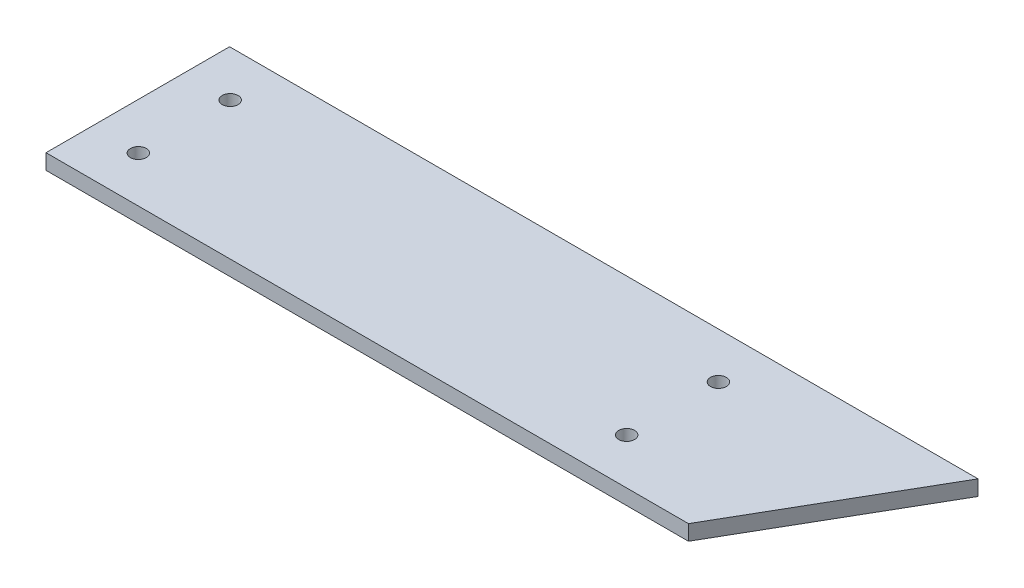
ISO-10303-21;
HEADER;
FILE_DESCRIPTION(('STEP AP214'),'2;1');
FILE_NAME('part.step','',(''),(''),'','','');
FILE_SCHEMA(('AUTOMOTIVE_DESIGN { 1 0 10303 214 1 1 1 1 }'));
ENDSEC;
DATA;
#1=APPLICATION_CONTEXT('core data for automotive mechanical design processes');
#2=APPLICATION_PROTOCOL_DEFINITION('international standard','automotive_design',2000,#1);
#3=PRODUCT_CONTEXT('',#1,'mechanical');
#4=PRODUCT('Part','Part','',(#3));
#5=PRODUCT_RELATED_PRODUCT_CATEGORY('part','',(#4));
#6=PRODUCT_DEFINITION_FORMATION('','',#4);
#7=PRODUCT_DEFINITION_CONTEXT('part definition',#1,'design');
#8=PRODUCT_DEFINITION('design','',#6,#7);
#9=PRODUCT_DEFINITION_SHAPE('','',#8);
#10=(LENGTH_UNIT() NAMED_UNIT(*) SI_UNIT(.MILLI.,.METRE.));
#11=(NAMED_UNIT(*) PLANE_ANGLE_UNIT() SI_UNIT($,.RADIAN.));
#12=(NAMED_UNIT(*) SI_UNIT($,.STERADIAN.) SOLID_ANGLE_UNIT());
#13=UNCERTAINTY_MEASURE_WITH_UNIT(LENGTH_MEASURE(1.E-05),#10,'distance_accuracy_value','');
#14=(GEOMETRIC_REPRESENTATION_CONTEXT(3) GLOBAL_UNCERTAINTY_ASSIGNED_CONTEXT((#13)) GLOBAL_UNIT_ASSIGNED_CONTEXT((#10,
#11,#12)) REPRESENTATION_CONTEXT('',''));
#15=CARTESIAN_POINT('',(0.,0.,0.));
#16=DIRECTION('',(0.,0.,1.));
#17=DIRECTION('',(1.,0.,0.));
#18=AXIS2_PLACEMENT_3D('',#15,#16,#17);
#19=CARTESIAN_POINT('',(-66.675,1.5875,19.05));
#20=DIRECTION('',(1.,0.,0.));
#21=DIRECTION('',(0.,0.,-1.));
#22=AXIS2_PLACEMENT_3D('',#19,#20,#21);
#23=PLANE('',#22);
#24=DIRECTION('',(0.,0.,1.));
#25=VECTOR('',#24,1.);
#26=CARTESIAN_POINT('',(-66.675,-1.5875,19.05));
#27=LINE('',#26,#25);
#28=CARTESIAN_POINT('',(-66.675,-1.5875,-19.05));
#29=VERTEX_POINT('',#28);
#30=CARTESIAN_POINT('',(-66.675,-1.5875,19.05));
#31=VERTEX_POINT('',#30);
#32=EDGE_CURVE('E108',#29,#31,#27,.T.);
#33=ORIENTED_EDGE('',*,*,#32,.T.);
#34=DIRECTION('',(0.,-1.,0.));
#35=VECTOR('',#34,1.);
#36=CARTESIAN_POINT('',(-66.675,1.5875,19.05));
#37=LINE('',#36,#35);
#38=CARTESIAN_POINT('',(-66.675,1.5875,19.05));
#39=VERTEX_POINT('',#38);
#40=EDGE_CURVE('E11',#39,#31,#37,.T.);
#41=ORIENTED_EDGE('',*,*,#40,.F.);
#42=DIRECTION('',(0.,0.,1.));
#43=VECTOR('',#42,1.);
#44=CARTESIAN_POINT('',(-66.675,1.5875,19.05));
#45=LINE('',#44,#43);
#46=CARTESIAN_POINT('',(-66.675,1.5875,-19.05));
#47=VERTEX_POINT('',#46);
#48=EDGE_CURVE('E90',#47,#39,#45,.T.);
#49=ORIENTED_EDGE('',*,*,#48,.F.);
#50=DIRECTION('',(0.,-1.,0.));
#51=VECTOR('',#50,1.);
#52=CARTESIAN_POINT('',(-66.675,1.5875,-19.05));
#53=LINE('',#52,#51);
#54=EDGE_CURVE('E104',#47,#29,#53,.T.);
#55=ORIENTED_EDGE('',*,*,#54,.T.);
#56=EDGE_LOOP('',(#33,#41,#49,#55));
#57=FACE_BOUND('',#56,.T.);
#58=ADVANCED_FACE('F39',(#57),#23,.F.);
#59=CARTESIAN_POINT('',(66.675,1.5875,19.05));
#60=DIRECTION('',(0.,0.,-1.));
#61=DIRECTION('',(-1.,0.,0.));
#62=AXIS2_PLACEMENT_3D('',#59,#60,#61);
#63=PLANE('',#62);
#64=DIRECTION('',(1.,0.,0.));
#65=VECTOR('',#64,1.);
#66=CARTESIAN_POINT('',(66.675,-1.5875,19.05));
#67=LINE('',#66,#65);
#68=CARTESIAN_POINT('',(66.675,-1.5875,19.05));
#69=VERTEX_POINT('',#68);
#70=EDGE_CURVE('E96',#31,#69,#67,.T.);
#71=ORIENTED_EDGE('',*,*,#70,.T.);
#72=DIRECTION('',(0.,-1.,0.));
#73=VECTOR('',#72,1.);
#74=CARTESIAN_POINT('',(66.675,1.5875,19.05));
#75=LINE('',#74,#73);
#76=CARTESIAN_POINT('',(66.675,1.5875,19.05));
#77=VERTEX_POINT('',#76);
#78=EDGE_CURVE('E48',#77,#69,#75,.T.);
#79=ORIENTED_EDGE('',*,*,#78,.F.);
#80=DIRECTION('',(1.,0.,0.));
#81=VECTOR('',#80,1.);
#82=CARTESIAN_POINT('',(66.675,1.5875,19.05));
#83=LINE('',#82,#81);
#84=EDGE_CURVE('E84',#39,#77,#83,.T.);
#85=ORIENTED_EDGE('',*,*,#84,.F.);
#86=ORIENTED_EDGE('',*,*,#40,.T.);
#87=EDGE_LOOP('',(#71,#79,#85,#86));
#88=FACE_BOUND('',#87,.T.);
#89=ADVANCED_FACE('F95',(#88),#63,.F.);
#90=CARTESIAN_POINT('',(88.672045256125,1.5875,-19.05));
#91=DIRECTION('',(-0.866025403784436,0.,-0.500000000000004));
#92=DIRECTION('',(-0.500000000000004,0.,0.866025403784436));
#93=AXIS2_PLACEMENT_3D('',#90,#91,#92);
#94=PLANE('',#93);
#95=DIRECTION('',(0.500000000000004,0.,-0.866025403784436));
#96=VECTOR('',#95,1.);
#97=CARTESIAN_POINT('',(88.672045256125,-1.5875,-19.05));
#98=LINE('',#97,#96);
#99=CARTESIAN_POINT('',(88.672045256125,-1.5875,-19.05));
#100=VERTEX_POINT('',#99);
#101=EDGE_CURVE('E115',#69,#100,#98,.T.);
#102=ORIENTED_EDGE('',*,*,#101,.T.);
#103=DIRECTION('',(0.,-1.,0.));
#104=VECTOR('',#103,1.);
#105=CARTESIAN_POINT('',(88.672045256125,1.5875,-19.05));
#106=LINE('',#105,#104);
#107=CARTESIAN_POINT('',(88.672045256125,1.5875,-19.05));
#108=VERTEX_POINT('',#107);
#109=EDGE_CURVE('E99',#108,#100,#106,.T.);
#110=ORIENTED_EDGE('',*,*,#109,.F.);
#111=DIRECTION('',(0.500000000000004,0.,-0.866025403784436));
#112=VECTOR('',#111,1.);
#113=CARTESIAN_POINT('',(88.672045256125,1.5875,-19.05));
#114=LINE('',#113,#112);
#115=EDGE_CURVE('E87',#77,#108,#114,.T.);
#116=ORIENTED_EDGE('',*,*,#115,.F.);
#117=ORIENTED_EDGE('',*,*,#78,.T.);
#118=EDGE_LOOP('',(#102,#110,#116,#117));
#119=FACE_BOUND('',#118,.T.);
#120=ADVANCED_FACE('F100',(#119),#94,.F.);
#121=CARTESIAN_POINT('',(66.675,1.5875,-19.05));
#122=DIRECTION('',(0.,0.,1.));
#123=DIRECTION('',(1.,0.,0.));
#124=AXIS2_PLACEMENT_3D('',#121,#122,#123);
#125=PLANE('',#124);
#126=DIRECTION('',(-1.,0.,0.));
#127=VECTOR('',#126,1.);
#128=CARTESIAN_POINT('',(66.675,-1.5875,-19.05));
#129=LINE('',#128,#127);
#130=EDGE_CURVE('E73',#100,#29,#129,.T.);
#131=ORIENTED_EDGE('',*,*,#130,.T.);
#132=ORIENTED_EDGE('',*,*,#54,.F.);
#133=DIRECTION('',(-1.,0.,0.));
#134=VECTOR('',#133,1.);
#135=CARTESIAN_POINT('',(66.675,1.5875,-19.05));
#136=LINE('',#135,#134);
#137=EDGE_CURVE('E56',#108,#47,#136,.T.);
#138=ORIENTED_EDGE('',*,*,#137,.F.);
#139=ORIENTED_EDGE('',*,*,#109,.T.);
#140=EDGE_LOOP('',(#131,#132,#138,#139));
#141=FACE_BOUND('',#140,.T.);
#142=ADVANCED_FACE('F123',(#141),#125,.F.);
#143=CARTESIAN_POINT('',(0.,1.5875,0.));
#144=DIRECTION('',(0.,1.,0.));
#145=DIRECTION('',(0.,0.,1.));
#146=AXIS2_PLACEMENT_3D('',#143,#144,#145);
#147=PLANE('',#146);
#148=CARTESIAN_POINT('',(-57.023,1.5875,-9.525));
#149=DIRECTION('',(0.,1.,0.));
#150=DIRECTION('',(0.,0.,1.));
#151=AXIS2_PLACEMENT_3D('',#148,#149,#150);
#152=CIRCLE('',#151,1.651);
#153=CARTESIAN_POINT('',(-57.023,1.5875,-7.874));
#154=VERTEX_POINT('',#153);
#155=EDGE_CURVE('E139',#154,#154,#152,.T.);
#156=ORIENTED_EDGE('',*,*,#155,.F.);
#157=EDGE_LOOP('',(#156));
#158=FACE_BOUND('',#157,.T.);
#159=CARTESIAN_POINT('',(44.323,1.5875,9.52499999999999));
#160=DIRECTION('',(0.,1.,0.));
#161=DIRECTION('',(0.,0.,1.));
#162=AXIS2_PLACEMENT_3D('',#159,#160,#161);
#163=CIRCLE('',#162,1.651);
#164=CARTESIAN_POINT('',(44.323,1.5875,11.176));
#165=VERTEX_POINT('',#164);
#166=EDGE_CURVE('E140',#165,#165,#163,.T.);
#167=ORIENTED_EDGE('',*,*,#166,.F.);
#168=EDGE_LOOP('',(#167));
#169=FACE_BOUND('',#168,.T.);
#170=CARTESIAN_POINT('',(44.323,1.5875,-9.52500000000001));
#171=DIRECTION('',(0.,1.,0.));
#172=DIRECTION('',(0.,0.,1.));
#173=AXIS2_PLACEMENT_3D('',#170,#171,#172);
#174=CIRCLE('',#173,1.651);
#175=CARTESIAN_POINT('',(44.323,1.5875,-7.87400000000001));
#176=VERTEX_POINT('',#175);
#177=EDGE_CURVE('E154',#176,#176,#174,.T.);
#178=ORIENTED_EDGE('',*,*,#177,.F.);
#179=EDGE_LOOP('',(#178));
#180=FACE_BOUND('',#179,.T.);
#181=CARTESIAN_POINT('',(-57.023,1.5875,9.525));
#182=DIRECTION('',(0.,1.,0.));
#183=DIRECTION('',(0.,0.,1.));
#184=AXIS2_PLACEMENT_3D('',#181,#182,#183);
#185=CIRCLE('',#184,1.651);
#186=CARTESIAN_POINT('',(-57.023,1.5875,11.176));
#187=VERTEX_POINT('',#186);
#188=EDGE_CURVE('E130',#187,#187,#185,.T.);
#189=ORIENTED_EDGE('',*,*,#188,.F.);
#190=EDGE_LOOP('',(#189));
#191=FACE_BOUND('',#190,.T.);
#192=ORIENTED_EDGE('',*,*,#48,.T.);
#193=ORIENTED_EDGE('',*,*,#84,.T.);
#194=ORIENTED_EDGE('',*,*,#115,.T.);
#195=ORIENTED_EDGE('',*,*,#137,.T.);
#196=EDGE_LOOP('',(#192,#193,#194,#195));
#197=FACE_BOUND('',#196,.T.);
#198=ADVANCED_FACE('F85',(#158,#169,#180,#191,#197),#147,.T.);
#199=CARTESIAN_POINT('',(0.,-1.5875,0.));
#200=DIRECTION('',(0.,1.,0.));
#201=DIRECTION('',(0.,0.,1.));
#202=AXIS2_PLACEMENT_3D('',#199,#200,#201);
#203=PLANE('',#202);
#204=CARTESIAN_POINT('',(-57.023,-1.5875,-9.525));
#205=DIRECTION('',(0.,1.,0.));
#206=DIRECTION('',(0.,0.,1.));
#207=AXIS2_PLACEMENT_3D('',#204,#205,#206);
#208=CIRCLE('',#207,1.651);
#209=CARTESIAN_POINT('',(-57.023,-1.5875,-7.874));
#210=VERTEX_POINT('',#209);
#211=EDGE_CURVE('E134',#210,#210,#208,.F.);
#212=ORIENTED_EDGE('',*,*,#211,.F.);
#213=EDGE_LOOP('',(#212));
#214=FACE_BOUND('',#213,.T.);
#215=CARTESIAN_POINT('',(44.323,-1.5875,9.52499999999999));
#216=DIRECTION('',(0.,1.,0.));
#217=DIRECTION('',(0.,0.,1.));
#218=AXIS2_PLACEMENT_3D('',#215,#216,#217);
#219=CIRCLE('',#218,1.651);
#220=CARTESIAN_POINT('',(44.323,-1.5875,11.176));
#221=VERTEX_POINT('',#220);
#222=EDGE_CURVE('E135',#221,#221,#219,.F.);
#223=ORIENTED_EDGE('',*,*,#222,.F.);
#224=EDGE_LOOP('',(#223));
#225=FACE_BOUND('',#224,.T.);
#226=CARTESIAN_POINT('',(44.323,-1.5875,-9.52500000000001));
#227=DIRECTION('',(0.,1.,0.));
#228=DIRECTION('',(0.,0.,1.));
#229=AXIS2_PLACEMENT_3D('',#226,#227,#228);
#230=CIRCLE('',#229,1.651);
#231=CARTESIAN_POINT('',(44.323,-1.5875,-7.87400000000001));
#232=VERTEX_POINT('',#231);
#233=EDGE_CURVE('E144',#232,#232,#230,.F.);
#234=ORIENTED_EDGE('',*,*,#233,.F.);
#235=EDGE_LOOP('',(#234));
#236=FACE_BOUND('',#235,.T.);
#237=CARTESIAN_POINT('',(-57.023,-1.5875,9.525));
#238=DIRECTION('',(0.,1.,0.));
#239=DIRECTION('',(0.,0.,1.));
#240=AXIS2_PLACEMENT_3D('',#237,#238,#239);
#241=CIRCLE('',#240,1.651);
#242=CARTESIAN_POINT('',(-57.023,-1.5875,11.176));
#243=VERTEX_POINT('',#242);
#244=EDGE_CURVE('E112',#243,#243,#241,.F.);
#245=ORIENTED_EDGE('',*,*,#244,.F.);
#246=EDGE_LOOP('',(#245));
#247=FACE_BOUND('',#246,.T.);
#248=ORIENTED_EDGE('',*,*,#32,.F.);
#249=ORIENTED_EDGE('',*,*,#130,.F.);
#250=ORIENTED_EDGE('',*,*,#101,.F.);
#251=ORIENTED_EDGE('',*,*,#70,.F.);
#252=EDGE_LOOP('',(#248,#249,#250,#251));
#253=FACE_BOUND('',#252,.T.);
#254=ADVANCED_FACE('F163',(#214,#225,#236,#247,#253),#203,.F.);
#255=CARTESIAN_POINT('',(-57.023,-6.25723318295596,9.525));
#256=DIRECTION('',(0.,1.,0.));
#257=DIRECTION('',(0.,0.,1.));
#258=AXIS2_PLACEMENT_3D('',#255,#256,#257);
#259=CYLINDRICAL_SURFACE('',#258,1.651);
#260=ORIENTED_EDGE('',*,*,#244,.T.);
#261=EDGE_LOOP('',(#260));
#262=FACE_BOUND('',#261,.T.);
#263=ORIENTED_EDGE('',*,*,#188,.T.);
#264=EDGE_LOOP('',(#263));
#265=FACE_BOUND('',#264,.T.);
#266=ADVANCED_FACE('F168',(#262,#265),#259,.F.);
#267=CARTESIAN_POINT('',(44.323,-6.25723318295596,-9.52500000000001));
#268=DIRECTION('',(0.,1.,0.));
#269=DIRECTION('',(0.,0.,1.));
#270=AXIS2_PLACEMENT_3D('',#267,#268,#269);
#271=CYLINDRICAL_SURFACE('',#270,1.651);
#272=ORIENTED_EDGE('',*,*,#233,.T.);
#273=EDGE_LOOP('',(#272));
#274=FACE_BOUND('',#273,.T.);
#275=ORIENTED_EDGE('',*,*,#177,.T.);
#276=EDGE_LOOP('',(#275));
#277=FACE_BOUND('',#276,.T.);
#278=ADVANCED_FACE('F159',(#274,#277),#271,.F.);
#279=CARTESIAN_POINT('',(44.323,-6.25723318295596,9.52499999999999));
#280=DIRECTION('',(0.,1.,0.));
#281=DIRECTION('',(0.,0.,1.));
#282=AXIS2_PLACEMENT_3D('',#279,#280,#281);
#283=CYLINDRICAL_SURFACE('',#282,1.651);
#284=ORIENTED_EDGE('',*,*,#222,.T.);
#285=EDGE_LOOP('',(#284));
#286=FACE_BOUND('',#285,.T.);
#287=ORIENTED_EDGE('',*,*,#166,.T.);
#288=EDGE_LOOP('',(#287));
#289=FACE_BOUND('',#288,.T.);
#290=ADVANCED_FACE('F176',(#286,#289),#283,.F.);
#291=CARTESIAN_POINT('',(-57.023,-6.25723318295596,-9.525));
#292=DIRECTION('',(0.,1.,0.));
#293=DIRECTION('',(0.,0.,1.));
#294=AXIS2_PLACEMENT_3D('',#291,#292,#293);
#295=CYLINDRICAL_SURFACE('',#294,1.651);
#296=ORIENTED_EDGE('',*,*,#211,.T.);
#297=EDGE_LOOP('',(#296));
#298=FACE_BOUND('',#297,.T.);
#299=ORIENTED_EDGE('',*,*,#155,.T.);
#300=EDGE_LOOP('',(#299));
#301=FACE_BOUND('',#300,.T.);
#302=ADVANCED_FACE('F223',(#298,#301),#295,.F.);
#303=CLOSED_SHELL('',(#58,#89,#120,#142,#198,#254,#266,#278,#290,#302));
#304=MANIFOLD_SOLID_BREP('B2',#303);
#305=ADVANCED_BREP_SHAPE_REPRESENTATION('',(#18,#304),#14);
#306=SHAPE_DEFINITION_REPRESENTATION(#9,#305);
ENDSEC;
END-ISO-10303-21;
